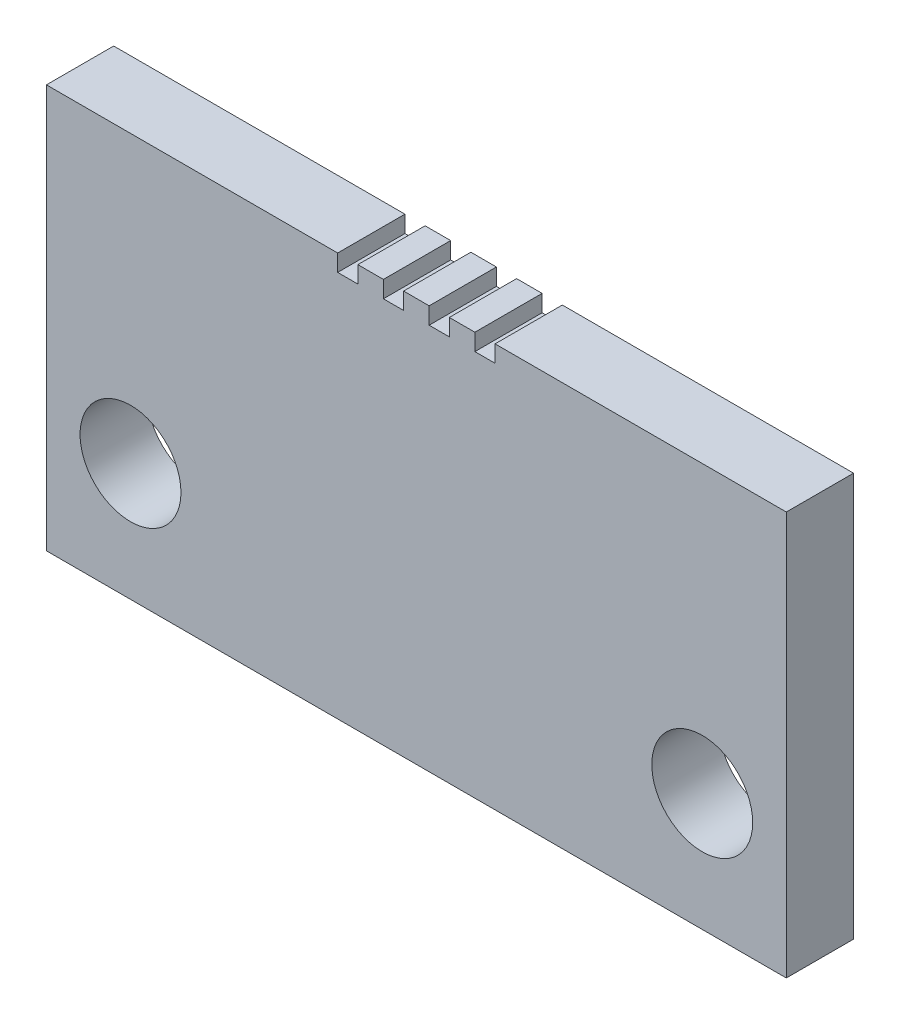
ISO-10303-21;
HEADER;
FILE_DESCRIPTION(('STEP AP214'),'2;1');
FILE_NAME('part.step','',(''),(''),'','','');
FILE_SCHEMA(('AUTOMOTIVE_DESIGN { 1 0 10303 214 1 1 1 1 }'));
ENDSEC;
DATA;
#1=APPLICATION_CONTEXT('core data for automotive mechanical design processes');
#2=APPLICATION_PROTOCOL_DEFINITION('international standard','automotive_design',2000,#1);
#3=PRODUCT_CONTEXT('',#1,'mechanical');
#4=PRODUCT('Part','Part','',(#3));
#5=PRODUCT_RELATED_PRODUCT_CATEGORY('part','',(#4));
#6=PRODUCT_DEFINITION_FORMATION('','',#4);
#7=PRODUCT_DEFINITION_CONTEXT('part definition',#1,'design');
#8=PRODUCT_DEFINITION('design','',#6,#7);
#9=PRODUCT_DEFINITION_SHAPE('','',#8);
#10=(LENGTH_UNIT() NAMED_UNIT(*) SI_UNIT(.MILLI.,.METRE.));
#11=(NAMED_UNIT(*) PLANE_ANGLE_UNIT() SI_UNIT($,.RADIAN.));
#12=(NAMED_UNIT(*) SI_UNIT($,.STERADIAN.) SOLID_ANGLE_UNIT());
#13=UNCERTAINTY_MEASURE_WITH_UNIT(LENGTH_MEASURE(1.E-05),#10,'distance_accuracy_value','');
#14=(GEOMETRIC_REPRESENTATION_CONTEXT(3) GLOBAL_UNCERTAINTY_ASSIGNED_CONTEXT((#13)) GLOBAL_UNIT_ASSIGNED_CONTEXT((#10,
#11,#12)) REPRESENTATION_CONTEXT('',''));
#15=CARTESIAN_POINT('',(0.,0.,0.));
#16=DIRECTION('',(0.,0.,1.));
#17=DIRECTION('',(1.,0.,0.));
#18=AXIS2_PLACEMENT_3D('',#15,#16,#17);
#19=CARTESIAN_POINT('',(0.,0.,2.));
#20=DIRECTION('',(0.,0.,1.));
#21=DIRECTION('',(1.,0.,0.));
#22=AXIS2_PLACEMENT_3D('',#19,#20,#21);
#23=PLANE('',#22);
#24=CARTESIAN_POINT('',(8.5,-2.50000000000001,2.));
#25=DIRECTION('',(0.,0.,1.));
#26=DIRECTION('',(1.,0.,0.));
#27=AXIS2_PLACEMENT_3D('',#24,#25,#26);
#28=CIRCLE('',#27,1.5);
#29=CARTESIAN_POINT('',(10.,-2.50000000000001,2.));
#30=VERTEX_POINT('',#29);
#31=EDGE_CURVE('E214',#30,#30,#28,.T.);
#32=ORIENTED_EDGE('',*,*,#31,.F.);
#33=EDGE_LOOP('',(#32));
#34=FACE_BOUND('',#33,.T.);
#35=DIRECTION('',(-1.,0.,0.));
#36=VECTOR('',#35,1.);
#37=CARTESIAN_POINT('',(2.34,5.99999999999999,2.));
#38=LINE('',#37,#36);
#39=CARTESIAN_POINT('',(11.,5.99999999999999,2.));
#40=VERTEX_POINT('',#39);
#41=CARTESIAN_POINT('',(2.34,5.99999999999999,2.));
#42=VERTEX_POINT('',#41);
#43=EDGE_CURVE('E249',#40,#42,#38,.T.);
#44=ORIENTED_EDGE('',*,*,#43,.T.);
#45=DIRECTION('',(0.,-1.,0.));
#46=VECTOR('',#45,1.);
#47=CARTESIAN_POINT('',(2.34,5.49999999999999,2.));
#48=LINE('',#47,#46);
#49=CARTESIAN_POINT('',(2.34,5.49999999999999,2.));
#50=VERTEX_POINT('',#49);
#51=EDGE_CURVE('E137',#42,#50,#48,.T.);
#52=ORIENTED_EDGE('',*,*,#51,.T.);
#53=DIRECTION('',(-1.,0.,0.));
#54=VECTOR('',#53,1.);
#55=CARTESIAN_POINT('',(1.74,5.49999999999999,2.));
#56=LINE('',#55,#54);
#57=CARTESIAN_POINT('',(1.74,5.49999999999999,2.));
#58=VERTEX_POINT('',#57);
#59=EDGE_CURVE('E300',#50,#58,#56,.T.);
#60=ORIENTED_EDGE('',*,*,#59,.T.);
#61=DIRECTION('',(0.,1.,0.));
#62=VECTOR('',#61,1.);
#63=CARTESIAN_POINT('',(1.74,5.99999999999999,2.));
#64=LINE('',#63,#62);
#65=CARTESIAN_POINT('',(1.74,5.99999999999999,2.));
#66=VERTEX_POINT('',#65);
#67=EDGE_CURVE('E319',#58,#66,#64,.T.);
#68=ORIENTED_EDGE('',*,*,#67,.T.);
#69=DIRECTION('',(-1.,0.,0.));
#70=VECTOR('',#69,1.);
#71=CARTESIAN_POINT('',(0.980000000000001,5.99999999999999,2.));
#72=LINE('',#71,#70);
#73=CARTESIAN_POINT('',(0.980000000000001,5.99999999999999,2.));
#74=VERTEX_POINT('',#73);
#75=EDGE_CURVE('E316',#66,#74,#72,.T.);
#76=ORIENTED_EDGE('',*,*,#75,.T.);
#77=DIRECTION('',(0.,-1.,0.));
#78=VECTOR('',#77,1.);
#79=CARTESIAN_POINT('',(0.98,5.49999999999999,2.));
#80=LINE('',#79,#78);
#81=CARTESIAN_POINT('',(0.98,5.49999999999999,2.));
#82=VERTEX_POINT('',#81);
#83=EDGE_CURVE('E318',#74,#82,#80,.T.);
#84=ORIENTED_EDGE('',*,*,#83,.T.);
#85=DIRECTION('',(-1.,0.,0.));
#86=VECTOR('',#85,1.);
#87=CARTESIAN_POINT('',(0.38,5.49999999999999,2.));
#88=LINE('',#87,#86);
#89=CARTESIAN_POINT('',(0.38,5.49999999999999,2.));
#90=VERTEX_POINT('',#89);
#91=EDGE_CURVE('E321',#82,#90,#88,.T.);
#92=ORIENTED_EDGE('',*,*,#91,.T.);
#93=DIRECTION('',(0.,1.,0.));
#94=VECTOR('',#93,1.);
#95=CARTESIAN_POINT('',(0.38,5.99999999999999,2.));
#96=LINE('',#95,#94);
#97=CARTESIAN_POINT('',(0.38,5.99999999999999,2.));
#98=VERTEX_POINT('',#97);
#99=EDGE_CURVE('E327',#90,#98,#96,.T.);
#100=ORIENTED_EDGE('',*,*,#99,.T.);
#101=DIRECTION('',(-1.,0.,0.));
#102=VECTOR('',#101,1.);
#103=CARTESIAN_POINT('',(-0.379999999999999,5.99999999999999,2.));
#104=LINE('',#103,#102);
#105=CARTESIAN_POINT('',(-0.379999999999999,5.99999999999999,2.));
#106=VERTEX_POINT('',#105);
#107=EDGE_CURVE('E329',#98,#106,#104,.T.);
#108=ORIENTED_EDGE('',*,*,#107,.T.);
#109=DIRECTION('',(0.,-1.,0.));
#110=VECTOR('',#109,1.);
#111=CARTESIAN_POINT('',(-0.379999999999999,5.49999999999999,2.));
#112=LINE('',#111,#110);
#113=CARTESIAN_POINT('',(-0.379999999999999,5.49999999999999,2.));
#114=VERTEX_POINT('',#113);
#115=EDGE_CURVE('E331',#106,#114,#112,.T.);
#116=ORIENTED_EDGE('',*,*,#115,.T.);
#117=DIRECTION('',(-1.,0.,0.));
#118=VECTOR('',#117,1.);
#119=CARTESIAN_POINT('',(-0.980000000000001,5.49999999999999,2.));
#120=LINE('',#119,#118);
#121=CARTESIAN_POINT('',(-0.980000000000001,5.49999999999999,2.));
#122=VERTEX_POINT('',#121);
#123=EDGE_CURVE('E333',#114,#122,#120,.T.);
#124=ORIENTED_EDGE('',*,*,#123,.T.);
#125=DIRECTION('',(0.,1.,0.));
#126=VECTOR('',#125,1.);
#127=CARTESIAN_POINT('',(-0.98,5.99999999999999,2.));
#128=LINE('',#127,#126);
#129=CARTESIAN_POINT('',(-0.98,5.99999999999999,2.));
#130=VERTEX_POINT('',#129);
#131=EDGE_CURVE('E335',#122,#130,#128,.T.);
#132=ORIENTED_EDGE('',*,*,#131,.T.);
#133=DIRECTION('',(-1.,0.,0.));
#134=VECTOR('',#133,1.);
#135=CARTESIAN_POINT('',(-1.74,5.99999999999999,2.));
#136=LINE('',#135,#134);
#137=CARTESIAN_POINT('',(-1.74,5.99999999999999,2.));
#138=VERTEX_POINT('',#137);
#139=EDGE_CURVE('E337',#130,#138,#136,.T.);
#140=ORIENTED_EDGE('',*,*,#139,.T.);
#141=DIRECTION('',(0.,-1.,0.));
#142=VECTOR('',#141,1.);
#143=CARTESIAN_POINT('',(-1.74,5.49999999999999,2.));
#144=LINE('',#143,#142);
#145=CARTESIAN_POINT('',(-1.74,5.49999999999999,2.));
#146=VERTEX_POINT('',#145);
#147=EDGE_CURVE('E339',#138,#146,#144,.T.);
#148=ORIENTED_EDGE('',*,*,#147,.T.);
#149=DIRECTION('',(-1.,0.,0.));
#150=VECTOR('',#149,1.);
#151=CARTESIAN_POINT('',(-2.34,5.49999999999999,2.));
#152=LINE('',#151,#150);
#153=CARTESIAN_POINT('',(-2.34,5.49999999999999,2.));
#154=VERTEX_POINT('',#153);
#155=EDGE_CURVE('E341',#146,#154,#152,.T.);
#156=ORIENTED_EDGE('',*,*,#155,.T.);
#157=DIRECTION('',(0.,1.,0.));
#158=VECTOR('',#157,1.);
#159=CARTESIAN_POINT('',(-2.34,5.99999999999999,2.));
#160=LINE('',#159,#158);
#161=CARTESIAN_POINT('',(-2.34,5.99999999999999,2.));
#162=VERTEX_POINT('',#161);
#163=EDGE_CURVE('E343',#154,#162,#160,.T.);
#164=ORIENTED_EDGE('',*,*,#163,.T.);
#165=DIRECTION('',(-1.,0.,0.));
#166=VECTOR('',#165,1.);
#167=CARTESIAN_POINT('',(-11.,5.99999999999999,2.));
#168=LINE('',#167,#166);
#169=CARTESIAN_POINT('',(-11.,5.99999999999999,2.));
#170=VERTEX_POINT('',#169);
#171=EDGE_CURVE('E192',#162,#170,#168,.T.);
#172=ORIENTED_EDGE('',*,*,#171,.T.);
#173=DIRECTION('',(0.,-1.,0.));
#174=VECTOR('',#173,1.);
#175=CARTESIAN_POINT('',(-11.,-6.00000000000001,2.));
#176=LINE('',#175,#174);
#177=CARTESIAN_POINT('',(-11.,-6.00000000000001,2.));
#178=VERTEX_POINT('',#177);
#179=EDGE_CURVE('E186',#170,#178,#176,.T.);
#180=ORIENTED_EDGE('',*,*,#179,.T.);
#181=DIRECTION('',(1.,0.,0.));
#182=VECTOR('',#181,1.);
#183=CARTESIAN_POINT('',(-11.,-6.00000000000001,2.));
#184=LINE('',#183,#182);
#185=CARTESIAN_POINT('',(11.,-6.00000000000001,2.));
#186=VERTEX_POINT('',#185);
#187=EDGE_CURVE('E190',#178,#186,#184,.T.);
#188=ORIENTED_EDGE('',*,*,#187,.T.);
#189=DIRECTION('',(0.,1.,0.));
#190=VECTOR('',#189,1.);
#191=CARTESIAN_POINT('',(11.,-6.00000000000001,2.));
#192=LINE('',#191,#190);
#193=EDGE_CURVE('E58',#186,#40,#192,.T.);
#194=ORIENTED_EDGE('',*,*,#193,.T.);
#195=EDGE_LOOP('',(#44,#52,#60,#68,#76,#84,#92,#100,#108,#116,#124,#132,#140,#148,#156,#164,
#172,#180,#188,#194));
#196=FACE_BOUND('',#195,.T.);
#197=CARTESIAN_POINT('',(-8.5,-2.50000000000001,2.));
#198=DIRECTION('',(0.,0.,1.));
#199=DIRECTION('',(1.,0.,0.));
#200=AXIS2_PLACEMENT_3D('',#197,#198,#199);
#201=CIRCLE('',#200,1.5);
#202=CARTESIAN_POINT('',(-7.,-2.50000000000001,2.));
#203=VERTEX_POINT('',#202);
#204=EDGE_CURVE('E385',#203,#203,#201,.T.);
#205=ORIENTED_EDGE('',*,*,#204,.F.);
#206=EDGE_LOOP('',(#205));
#207=FACE_BOUND('',#206,.T.);
#208=ADVANCED_FACE('F41',(#34,#196,#207),#23,.T.);
#209=CARTESIAN_POINT('',(0.,0.,0.));
#210=DIRECTION('',(0.,0.,1.));
#211=DIRECTION('',(1.,0.,0.));
#212=AXIS2_PLACEMENT_3D('',#209,#210,#211);
#213=PLANE('',#212);
#214=DIRECTION('',(-1.,0.,0.));
#215=VECTOR('',#214,1.);
#216=CARTESIAN_POINT('',(2.34,5.99999999999999,0.));
#217=LINE('',#216,#215);
#218=CARTESIAN_POINT('',(11.,5.99999999999999,0.));
#219=VERTEX_POINT('',#218);
#220=CARTESIAN_POINT('',(2.34,5.99999999999999,0.));
#221=VERTEX_POINT('',#220);
#222=EDGE_CURVE('E210',#219,#221,#217,.T.);
#223=ORIENTED_EDGE('',*,*,#222,.F.);
#224=DIRECTION('',(0.,1.,0.));
#225=VECTOR('',#224,1.);
#226=CARTESIAN_POINT('',(11.,-6.00000000000001,0.));
#227=LINE('',#226,#225);
#228=CARTESIAN_POINT('',(11.,-6.00000000000001,0.));
#229=VERTEX_POINT('',#228);
#230=EDGE_CURVE('E129',#229,#219,#227,.T.);
#231=ORIENTED_EDGE('',*,*,#230,.F.);
#232=DIRECTION('',(1.,0.,0.));
#233=VECTOR('',#232,1.);
#234=CARTESIAN_POINT('',(-11.,-6.00000000000001,0.));
#235=LINE('',#234,#233);
#236=CARTESIAN_POINT('',(-11.,-6.00000000000001,0.));
#237=VERTEX_POINT('',#236);
#238=EDGE_CURVE('E123',#237,#229,#235,.T.);
#239=ORIENTED_EDGE('',*,*,#238,.F.);
#240=DIRECTION('',(0.,-1.,0.));
#241=VECTOR('',#240,1.);
#242=CARTESIAN_POINT('',(-11.,-6.00000000000001,0.));
#243=LINE('',#242,#241);
#244=CARTESIAN_POINT('',(-11.,5.99999999999999,0.));
#245=VERTEX_POINT('',#244);
#246=EDGE_CURVE('E200',#245,#237,#243,.T.);
#247=ORIENTED_EDGE('',*,*,#246,.F.);
#248=DIRECTION('',(-1.,0.,0.));
#249=VECTOR('',#248,1.);
#250=CARTESIAN_POINT('',(-11.,5.99999999999999,0.));
#251=LINE('',#250,#249);
#252=CARTESIAN_POINT('',(-2.34,5.99999999999999,0.));
#253=VERTEX_POINT('',#252);
#254=EDGE_CURVE('E244',#253,#245,#251,.T.);
#255=ORIENTED_EDGE('',*,*,#254,.F.);
#256=DIRECTION('',(0.,1.,0.));
#257=VECTOR('',#256,1.);
#258=CARTESIAN_POINT('',(-2.34,5.99999999999999,0.));
#259=LINE('',#258,#257);
#260=CARTESIAN_POINT('',(-2.34,5.49999999999999,0.));
#261=VERTEX_POINT('',#260);
#262=EDGE_CURVE('E242',#261,#253,#259,.T.);
#263=ORIENTED_EDGE('',*,*,#262,.F.);
#264=DIRECTION('',(-1.,0.,0.));
#265=VECTOR('',#264,1.);
#266=CARTESIAN_POINT('',(-2.34,5.49999999999999,0.));
#267=LINE('',#266,#265);
#268=CARTESIAN_POINT('',(-1.74,5.49999999999999,0.));
#269=VERTEX_POINT('',#268);
#270=EDGE_CURVE('E240',#269,#261,#267,.T.);
#271=ORIENTED_EDGE('',*,*,#270,.F.);
#272=DIRECTION('',(0.,-1.,0.));
#273=VECTOR('',#272,1.);
#274=CARTESIAN_POINT('',(-1.74,5.49999999999999,0.));
#275=LINE('',#274,#273);
#276=CARTESIAN_POINT('',(-1.74,5.99999999999999,0.));
#277=VERTEX_POINT('',#276);
#278=EDGE_CURVE('E238',#277,#269,#275,.T.);
#279=ORIENTED_EDGE('',*,*,#278,.F.);
#280=DIRECTION('',(-1.,0.,0.));
#281=VECTOR('',#280,1.);
#282=CARTESIAN_POINT('',(-1.74,5.99999999999999,0.));
#283=LINE('',#282,#281);
#284=CARTESIAN_POINT('',(-0.98,5.99999999999999,0.));
#285=VERTEX_POINT('',#284);
#286=EDGE_CURVE('E236',#285,#277,#283,.T.);
#287=ORIENTED_EDGE('',*,*,#286,.F.);
#288=DIRECTION('',(0.,1.,0.));
#289=VECTOR('',#288,1.);
#290=CARTESIAN_POINT('',(-0.98,5.99999999999999,0.));
#291=LINE('',#290,#289);
#292=CARTESIAN_POINT('',(-0.980000000000001,5.49999999999999,0.));
#293=VERTEX_POINT('',#292);
#294=EDGE_CURVE('E234',#293,#285,#291,.T.);
#295=ORIENTED_EDGE('',*,*,#294,.F.);
#296=DIRECTION('',(-1.,0.,0.));
#297=VECTOR('',#296,1.);
#298=CARTESIAN_POINT('',(-0.980000000000001,5.49999999999999,0.));
#299=LINE('',#298,#297);
#300=CARTESIAN_POINT('',(-0.379999999999999,5.49999999999999,0.));
#301=VERTEX_POINT('',#300);
#302=EDGE_CURVE('E232',#301,#293,#299,.T.);
#303=ORIENTED_EDGE('',*,*,#302,.F.);
#304=DIRECTION('',(0.,-1.,0.));
#305=VECTOR('',#304,1.);
#306=CARTESIAN_POINT('',(-0.379999999999999,5.49999999999999,0.));
#307=LINE('',#306,#305);
#308=CARTESIAN_POINT('',(-0.379999999999999,5.99999999999999,0.));
#309=VERTEX_POINT('',#308);
#310=EDGE_CURVE('E230',#309,#301,#307,.T.);
#311=ORIENTED_EDGE('',*,*,#310,.F.);
#312=DIRECTION('',(-1.,0.,0.));
#313=VECTOR('',#312,1.);
#314=CARTESIAN_POINT('',(-0.379999999999999,5.99999999999999,0.));
#315=LINE('',#314,#313);
#316=CARTESIAN_POINT('',(0.38,5.99999999999999,0.));
#317=VERTEX_POINT('',#316);
#318=EDGE_CURVE('E228',#317,#309,#315,.T.);
#319=ORIENTED_EDGE('',*,*,#318,.F.);
#320=DIRECTION('',(0.,1.,0.));
#321=VECTOR('',#320,1.);
#322=CARTESIAN_POINT('',(0.38,5.99999999999999,0.));
#323=LINE('',#322,#321);
#324=CARTESIAN_POINT('',(0.38,5.49999999999999,0.));
#325=VERTEX_POINT('',#324);
#326=EDGE_CURVE('E226',#325,#317,#323,.T.);
#327=ORIENTED_EDGE('',*,*,#326,.F.);
#328=DIRECTION('',(-1.,0.,0.));
#329=VECTOR('',#328,1.);
#330=CARTESIAN_POINT('',(0.38,5.49999999999999,0.));
#331=LINE('',#330,#329);
#332=CARTESIAN_POINT('',(0.98,5.49999999999999,0.));
#333=VERTEX_POINT('',#332);
#334=EDGE_CURVE('E224',#333,#325,#331,.T.);
#335=ORIENTED_EDGE('',*,*,#334,.F.);
#336=DIRECTION('',(0.,-1.,0.));
#337=VECTOR('',#336,1.);
#338=CARTESIAN_POINT('',(0.98,5.49999999999999,0.));
#339=LINE('',#338,#337);
#340=CARTESIAN_POINT('',(0.980000000000001,5.99999999999999,0.));
#341=VERTEX_POINT('',#340);
#342=EDGE_CURVE('E222',#341,#333,#339,.T.);
#343=ORIENTED_EDGE('',*,*,#342,.F.);
#344=DIRECTION('',(-1.,0.,0.));
#345=VECTOR('',#344,1.);
#346=CARTESIAN_POINT('',(0.980000000000001,5.99999999999999,0.));
#347=LINE('',#346,#345);
#348=CARTESIAN_POINT('',(1.74,5.99999999999999,0.));
#349=VERTEX_POINT('',#348);
#350=EDGE_CURVE('E220',#349,#341,#347,.T.);
#351=ORIENTED_EDGE('',*,*,#350,.F.);
#352=DIRECTION('',(0.,1.,0.));
#353=VECTOR('',#352,1.);
#354=CARTESIAN_POINT('',(1.74,5.99999999999999,0.));
#355=LINE('',#354,#353);
#356=CARTESIAN_POINT('',(1.74,5.49999999999999,0.));
#357=VERTEX_POINT('',#356);
#358=EDGE_CURVE('E218',#357,#349,#355,.T.);
#359=ORIENTED_EDGE('',*,*,#358,.F.);
#360=DIRECTION('',(-1.,0.,0.));
#361=VECTOR('',#360,1.);
#362=CARTESIAN_POINT('',(1.74,5.49999999999999,0.));
#363=LINE('',#362,#361);
#364=CARTESIAN_POINT('',(2.34,5.49999999999999,0.));
#365=VERTEX_POINT('',#364);
#366=EDGE_CURVE('E216',#365,#357,#363,.T.);
#367=ORIENTED_EDGE('',*,*,#366,.F.);
#368=DIRECTION('',(0.,-1.,0.));
#369=VECTOR('',#368,1.);
#370=CARTESIAN_POINT('',(2.34,5.49999999999999,0.));
#371=LINE('',#370,#369);
#372=EDGE_CURVE('E213',#221,#365,#371,.T.);
#373=ORIENTED_EDGE('',*,*,#372,.F.);
#374=EDGE_LOOP('',(#223,#231,#239,#247,#255,#263,#271,#279,#287,#295,#303,#311,#319,#327,#335,
#343,#351,#359,#367,#373));
#375=FACE_BOUND('',#374,.T.);
#376=CARTESIAN_POINT('',(8.5,-2.50000000000001,0.));
#377=DIRECTION('',(0.,0.,1.));
#378=DIRECTION('',(1.,0.,0.));
#379=AXIS2_PLACEMENT_3D('',#376,#377,#378);
#380=CIRCLE('',#379,1.5);
#381=CARTESIAN_POINT('',(10.,-2.50000000000001,0.));
#382=VERTEX_POINT('',#381);
#383=EDGE_CURVE('E391',#382,#382,#380,.T.);
#384=ORIENTED_EDGE('',*,*,#383,.T.);
#385=EDGE_LOOP('',(#384));
#386=FACE_BOUND('',#385,.T.);
#387=CARTESIAN_POINT('',(-8.5,-2.50000000000001,0.));
#388=DIRECTION('',(0.,0.,1.));
#389=DIRECTION('',(1.,0.,0.));
#390=AXIS2_PLACEMENT_3D('',#387,#388,#389);
#391=CIRCLE('',#390,1.5);
#392=CARTESIAN_POINT('',(-7.,-2.50000000000001,0.));
#393=VERTEX_POINT('',#392);
#394=EDGE_CURVE('E388',#393,#393,#391,.T.);
#395=ORIENTED_EDGE('',*,*,#394,.T.);
#396=EDGE_LOOP('',(#395));
#397=FACE_BOUND('',#396,.T.);
#398=ADVANCED_FACE('F304',(#375,#386,#397),#213,.F.);
#399=CARTESIAN_POINT('',(2.34,5.99999999999999,2.));
#400=DIRECTION('',(0.,-1.,0.));
#401=DIRECTION('',(0.,0.,-1.));
#402=AXIS2_PLACEMENT_3D('',#399,#400,#401);
#403=PLANE('',#402);
#404=ORIENTED_EDGE('',*,*,#222,.T.);
#405=DIRECTION('',(0.,0.,-1.));
#406=VECTOR('',#405,1.);
#407=CARTESIAN_POINT('',(2.34,5.99999999999999,2.));
#408=LINE('',#407,#406);
#409=EDGE_CURVE('E11',#42,#221,#408,.T.);
#410=ORIENTED_EDGE('',*,*,#409,.F.);
#411=ORIENTED_EDGE('',*,*,#43,.F.);
#412=DIRECTION('',(0.,0.,-1.));
#413=VECTOR('',#412,1.);
#414=CARTESIAN_POINT('',(11.,5.99999999999999,2.));
#415=LINE('',#414,#413);
#416=EDGE_CURVE('E206',#40,#219,#415,.T.);
#417=ORIENTED_EDGE('',*,*,#416,.T.);
#418=EDGE_LOOP('',(#404,#410,#411,#417));
#419=FACE_BOUND('',#418,.T.);
#420=ADVANCED_FACE('F43',(#419),#403,.F.);
#421=CARTESIAN_POINT('',(2.34,5.49999999999999,2.));
#422=DIRECTION('',(1.,0.,0.));
#423=DIRECTION('',(0.,0.,-1.));
#424=AXIS2_PLACEMENT_3D('',#421,#422,#423);
#425=PLANE('',#424);
#426=ORIENTED_EDGE('',*,*,#372,.T.);
#427=DIRECTION('',(0.,0.,-1.));
#428=VECTOR('',#427,1.);
#429=CARTESIAN_POINT('',(2.34,5.49999999999999,2.));
#430=LINE('',#429,#428);
#431=EDGE_CURVE('E50',#50,#365,#430,.T.);
#432=ORIENTED_EDGE('',*,*,#431,.F.);
#433=ORIENTED_EDGE('',*,*,#51,.F.);
#434=ORIENTED_EDGE('',*,*,#409,.T.);
#435=EDGE_LOOP('',(#426,#432,#433,#434));
#436=FACE_BOUND('',#435,.T.);
#437=ADVANCED_FACE('F582',(#436),#425,.F.);
#438=CARTESIAN_POINT('',(1.74,5.49999999999999,2.));
#439=DIRECTION('',(0.,-1.,0.));
#440=DIRECTION('',(1.,0.,0.));
#441=AXIS2_PLACEMENT_3D('',#438,#439,#440);
#442=PLANE('',#441);
#443=ORIENTED_EDGE('',*,*,#366,.T.);
#444=DIRECTION('',(0.,0.,-1.));
#445=VECTOR('',#444,1.);
#446=CARTESIAN_POINT('',(1.74,5.49999999999999,2.));
#447=LINE('',#446,#445);
#448=EDGE_CURVE('E292',#58,#357,#447,.T.);
#449=ORIENTED_EDGE('',*,*,#448,.F.);
#450=ORIENTED_EDGE('',*,*,#59,.F.);
#451=ORIENTED_EDGE('',*,*,#431,.T.);
#452=EDGE_LOOP('',(#443,#449,#450,#451));
#453=FACE_BOUND('',#452,.T.);
#454=ADVANCED_FACE('F298',(#453),#442,.F.);
#455=CARTESIAN_POINT('',(1.74,5.99999999999999,2.));
#456=DIRECTION('',(-1.,0.,0.));
#457=DIRECTION('',(0.,-1.,0.));
#458=AXIS2_PLACEMENT_3D('',#455,#456,#457);
#459=PLANE('',#458);
#460=ORIENTED_EDGE('',*,*,#358,.T.);
#461=DIRECTION('',(0.,0.,-1.));
#462=VECTOR('',#461,1.);
#463=CARTESIAN_POINT('',(1.74,5.99999999999999,2.));
#464=LINE('',#463,#462);
#465=EDGE_CURVE('E289',#66,#349,#464,.T.);
#466=ORIENTED_EDGE('',*,*,#465,.F.);
#467=ORIENTED_EDGE('',*,*,#67,.F.);
#468=ORIENTED_EDGE('',*,*,#448,.T.);
#469=EDGE_LOOP('',(#460,#466,#467,#468));
#470=FACE_BOUND('',#469,.T.);
#471=ADVANCED_FACE('F310',(#470),#459,.F.);
#472=CARTESIAN_POINT('',(0.980000000000001,5.99999999999999,2.));
#473=DIRECTION('',(0.,-1.,0.));
#474=DIRECTION('',(0.,0.,-1.));
#475=AXIS2_PLACEMENT_3D('',#472,#473,#474);
#476=PLANE('',#475);
#477=ORIENTED_EDGE('',*,*,#350,.T.);
#478=DIRECTION('',(0.,0.,-1.));
#479=VECTOR('',#478,1.);
#480=CARTESIAN_POINT('',(0.980000000000001,5.99999999999999,2.));
#481=LINE('',#480,#479);
#482=EDGE_CURVE('E286',#74,#341,#481,.T.);
#483=ORIENTED_EDGE('',*,*,#482,.F.);
#484=ORIENTED_EDGE('',*,*,#75,.F.);
#485=ORIENTED_EDGE('',*,*,#465,.T.);
#486=EDGE_LOOP('',(#477,#483,#484,#485));
#487=FACE_BOUND('',#486,.T.);
#488=ADVANCED_FACE('F314',(#487),#476,.F.);
#489=CARTESIAN_POINT('',(0.98,5.49999999999999,2.));
#490=DIRECTION('',(1.,0.,0.));
#491=DIRECTION('',(0.,1.,0.));
#492=AXIS2_PLACEMENT_3D('',#489,#490,#491);
#493=PLANE('',#492);
#494=ORIENTED_EDGE('',*,*,#342,.T.);
#495=DIRECTION('',(0.,0.,-1.));
#496=VECTOR('',#495,1.);
#497=CARTESIAN_POINT('',(0.98,5.49999999999999,2.));
#498=LINE('',#497,#496);
#499=EDGE_CURVE('E283',#82,#333,#498,.T.);
#500=ORIENTED_EDGE('',*,*,#499,.F.);
#501=ORIENTED_EDGE('',*,*,#83,.F.);
#502=ORIENTED_EDGE('',*,*,#482,.T.);
#503=EDGE_LOOP('',(#494,#500,#501,#502));
#504=FACE_BOUND('',#503,.T.);
#505=ADVANCED_FACE('F543',(#504),#493,.F.);
#506=CARTESIAN_POINT('',(0.38,5.49999999999999,2.));
#507=DIRECTION('',(0.,-1.,0.));
#508=DIRECTION('',(1.,0.,0.));
#509=AXIS2_PLACEMENT_3D('',#506,#507,#508);
#510=PLANE('',#509);
#511=ORIENTED_EDGE('',*,*,#334,.T.);
#512=DIRECTION('',(0.,0.,-1.));
#513=VECTOR('',#512,1.);
#514=CARTESIAN_POINT('',(0.38,5.49999999999999,2.));
#515=LINE('',#514,#513);
#516=EDGE_CURVE('E280',#90,#325,#515,.T.);
#517=ORIENTED_EDGE('',*,*,#516,.F.);
#518=ORIENTED_EDGE('',*,*,#91,.F.);
#519=ORIENTED_EDGE('',*,*,#499,.T.);
#520=EDGE_LOOP('',(#511,#517,#518,#519));
#521=FACE_BOUND('',#520,.T.);
#522=ADVANCED_FACE('F532',(#521),#510,.F.);
#523=CARTESIAN_POINT('',(0.38,5.99999999999999,2.));
#524=DIRECTION('',(-1.,0.,0.));
#525=DIRECTION('',(0.,-1.,0.));
#526=AXIS2_PLACEMENT_3D('',#523,#524,#525);
#527=PLANE('',#526);
#528=ORIENTED_EDGE('',*,*,#326,.T.);
#529=DIRECTION('',(0.,0.,-1.));
#530=VECTOR('',#529,1.);
#531=CARTESIAN_POINT('',(0.38,5.99999999999999,2.));
#532=LINE('',#531,#530);
#533=EDGE_CURVE('E277',#98,#317,#532,.T.);
#534=ORIENTED_EDGE('',*,*,#533,.F.);
#535=ORIENTED_EDGE('',*,*,#99,.F.);
#536=ORIENTED_EDGE('',*,*,#516,.T.);
#537=EDGE_LOOP('',(#528,#534,#535,#536));
#538=FACE_BOUND('',#537,.T.);
#539=ADVANCED_FACE('F521',(#538),#527,.F.);
#540=CARTESIAN_POINT('',(-0.379999999999999,5.99999999999999,2.));
#541=DIRECTION('',(0.,-1.,0.));
#542=DIRECTION('',(0.,0.,-1.));
#543=AXIS2_PLACEMENT_3D('',#540,#541,#542);
#544=PLANE('',#543);
#545=ORIENTED_EDGE('',*,*,#318,.T.);
#546=DIRECTION('',(0.,0.,-1.));
#547=VECTOR('',#546,1.);
#548=CARTESIAN_POINT('',(-0.379999999999999,5.99999999999999,2.));
#549=LINE('',#548,#547);
#550=EDGE_CURVE('E274',#106,#309,#549,.T.);
#551=ORIENTED_EDGE('',*,*,#550,.F.);
#552=ORIENTED_EDGE('',*,*,#107,.F.);
#553=ORIENTED_EDGE('',*,*,#533,.T.);
#554=EDGE_LOOP('',(#545,#551,#552,#553));
#555=FACE_BOUND('',#554,.T.);
#556=ADVANCED_FACE('F510',(#555),#544,.F.);
#557=CARTESIAN_POINT('',(-0.379999999999999,5.49999999999999,2.));
#558=DIRECTION('',(1.,0.,0.));
#559=DIRECTION('',(0.,1.,0.));
#560=AXIS2_PLACEMENT_3D('',#557,#558,#559);
#561=PLANE('',#560);
#562=ORIENTED_EDGE('',*,*,#310,.T.);
#563=DIRECTION('',(0.,0.,-1.));
#564=VECTOR('',#563,1.);
#565=CARTESIAN_POINT('',(-0.379999999999999,5.49999999999999,2.));
#566=LINE('',#565,#564);
#567=EDGE_CURVE('E271',#114,#301,#566,.T.);
#568=ORIENTED_EDGE('',*,*,#567,.F.);
#569=ORIENTED_EDGE('',*,*,#115,.F.);
#570=ORIENTED_EDGE('',*,*,#550,.T.);
#571=EDGE_LOOP('',(#562,#568,#569,#570));
#572=FACE_BOUND('',#571,.T.);
#573=ADVANCED_FACE('F499',(#572),#561,.F.);
#574=CARTESIAN_POINT('',(-0.980000000000001,5.49999999999999,2.));
#575=DIRECTION('',(0.,-1.,0.));
#576=DIRECTION('',(0.,0.,-1.));
#577=AXIS2_PLACEMENT_3D('',#574,#575,#576);
#578=PLANE('',#577);
#579=ORIENTED_EDGE('',*,*,#302,.T.);
#580=DIRECTION('',(0.,0.,-1.));
#581=VECTOR('',#580,1.);
#582=CARTESIAN_POINT('',(-0.980000000000001,5.49999999999999,2.));
#583=LINE('',#582,#581);
#584=EDGE_CURVE('E268',#122,#293,#583,.T.);
#585=ORIENTED_EDGE('',*,*,#584,.F.);
#586=ORIENTED_EDGE('',*,*,#123,.F.);
#587=ORIENTED_EDGE('',*,*,#567,.T.);
#588=EDGE_LOOP('',(#579,#585,#586,#587));
#589=FACE_BOUND('',#588,.T.);
#590=ADVANCED_FACE('F488',(#589),#578,.F.);
#591=CARTESIAN_POINT('',(-0.98,5.99999999999999,2.));
#592=DIRECTION('',(-1.,0.,0.));
#593=DIRECTION('',(0.,-1.,0.));
#594=AXIS2_PLACEMENT_3D('',#591,#592,#593);
#595=PLANE('',#594);
#596=ORIENTED_EDGE('',*,*,#294,.T.);
#597=DIRECTION('',(0.,0.,-1.));
#598=VECTOR('',#597,1.);
#599=CARTESIAN_POINT('',(-0.98,5.99999999999999,2.));
#600=LINE('',#599,#598);
#601=EDGE_CURVE('E265',#130,#285,#600,.T.);
#602=ORIENTED_EDGE('',*,*,#601,.F.);
#603=ORIENTED_EDGE('',*,*,#131,.F.);
#604=ORIENTED_EDGE('',*,*,#584,.T.);
#605=EDGE_LOOP('',(#596,#602,#603,#604));
#606=FACE_BOUND('',#605,.T.);
#607=ADVANCED_FACE('F477',(#606),#595,.F.);
#608=CARTESIAN_POINT('',(-1.74,5.99999999999999,2.));
#609=DIRECTION('',(0.,-1.,0.));
#610=DIRECTION('',(0.,0.,-1.));
#611=AXIS2_PLACEMENT_3D('',#608,#609,#610);
#612=PLANE('',#611);
#613=ORIENTED_EDGE('',*,*,#286,.T.);
#614=DIRECTION('',(0.,0.,-1.));
#615=VECTOR('',#614,1.);
#616=CARTESIAN_POINT('',(-1.74,5.99999999999999,2.));
#617=LINE('',#616,#615);
#618=EDGE_CURVE('E262',#138,#277,#617,.T.);
#619=ORIENTED_EDGE('',*,*,#618,.F.);
#620=ORIENTED_EDGE('',*,*,#139,.F.);
#621=ORIENTED_EDGE('',*,*,#601,.T.);
#622=EDGE_LOOP('',(#613,#619,#620,#621));
#623=FACE_BOUND('',#622,.T.);
#624=ADVANCED_FACE('F466',(#623),#612,.F.);
#625=CARTESIAN_POINT('',(-1.74,5.49999999999999,2.));
#626=DIRECTION('',(1.,0.,0.));
#627=DIRECTION('',(0.,1.,0.));
#628=AXIS2_PLACEMENT_3D('',#625,#626,#627);
#629=PLANE('',#628);
#630=ORIENTED_EDGE('',*,*,#278,.T.);
#631=DIRECTION('',(0.,0.,-1.));
#632=VECTOR('',#631,1.);
#633=CARTESIAN_POINT('',(-1.74,5.49999999999999,2.));
#634=LINE('',#633,#632);
#635=EDGE_CURVE('E259',#146,#269,#634,.T.);
#636=ORIENTED_EDGE('',*,*,#635,.F.);
#637=ORIENTED_EDGE('',*,*,#147,.F.);
#638=ORIENTED_EDGE('',*,*,#618,.T.);
#639=EDGE_LOOP('',(#630,#636,#637,#638));
#640=FACE_BOUND('',#639,.T.);
#641=ADVANCED_FACE('F455',(#640),#629,.F.);
#642=CARTESIAN_POINT('',(-2.34,5.49999999999999,2.));
#643=DIRECTION('',(0.,-1.,0.));
#644=DIRECTION('',(1.,0.,0.));
#645=AXIS2_PLACEMENT_3D('',#642,#643,#644);
#646=PLANE('',#645);
#647=ORIENTED_EDGE('',*,*,#270,.T.);
#648=DIRECTION('',(0.,0.,-1.));
#649=VECTOR('',#648,1.);
#650=CARTESIAN_POINT('',(-2.34,5.49999999999999,2.));
#651=LINE('',#650,#649);
#652=EDGE_CURVE('E256',#154,#261,#651,.T.);
#653=ORIENTED_EDGE('',*,*,#652,.F.);
#654=ORIENTED_EDGE('',*,*,#155,.F.);
#655=ORIENTED_EDGE('',*,*,#635,.T.);
#656=EDGE_LOOP('',(#647,#653,#654,#655));
#657=FACE_BOUND('',#656,.T.);
#658=ADVANCED_FACE('F445',(#657),#646,.F.);
#659=CARTESIAN_POINT('',(-2.34,5.99999999999999,2.));
#660=DIRECTION('',(-1.,0.,0.));
#661=DIRECTION('',(0.,-1.,0.));
#662=AXIS2_PLACEMENT_3D('',#659,#660,#661);
#663=PLANE('',#662);
#664=ORIENTED_EDGE('',*,*,#262,.T.);
#665=DIRECTION('',(0.,0.,-1.));
#666=VECTOR('',#665,1.);
#667=CARTESIAN_POINT('',(-2.34,5.99999999999999,2.));
#668=LINE('',#667,#666);
#669=EDGE_CURVE('E253',#162,#253,#668,.T.);
#670=ORIENTED_EDGE('',*,*,#669,.F.);
#671=ORIENTED_EDGE('',*,*,#163,.F.);
#672=ORIENTED_EDGE('',*,*,#652,.T.);
#673=EDGE_LOOP('',(#664,#670,#671,#672));
#674=FACE_BOUND('',#673,.T.);
#675=ADVANCED_FACE('F349',(#674),#663,.F.);
#676=CARTESIAN_POINT('',(-11.,5.99999999999999,2.));
#677=DIRECTION('',(0.,-1.,0.));
#678=DIRECTION('',(0.,0.,-1.));
#679=AXIS2_PLACEMENT_3D('',#676,#677,#678);
#680=PLANE('',#679);
#681=ORIENTED_EDGE('',*,*,#254,.T.);
#682=DIRECTION('',(0.,0.,-1.));
#683=VECTOR('',#682,1.);
#684=CARTESIAN_POINT('',(-11.,5.99999999999999,2.));
#685=LINE('',#684,#683);
#686=EDGE_CURVE('E201',#170,#245,#685,.T.);
#687=ORIENTED_EDGE('',*,*,#686,.F.);
#688=ORIENTED_EDGE('',*,*,#171,.F.);
#689=ORIENTED_EDGE('',*,*,#669,.T.);
#690=EDGE_LOOP('',(#681,#687,#688,#689));
#691=FACE_BOUND('',#690,.T.);
#692=ADVANCED_FACE('F353',(#691),#680,.F.);
#693=CARTESIAN_POINT('',(-11.,-6.00000000000001,2.));
#694=DIRECTION('',(1.,0.,0.));
#695=DIRECTION('',(0.,0.,-1.));
#696=AXIS2_PLACEMENT_3D('',#693,#694,#695);
#697=PLANE('',#696);
#698=ORIENTED_EDGE('',*,*,#246,.T.);
#699=DIRECTION('',(0.,0.,-1.));
#700=VECTOR('',#699,1.);
#701=CARTESIAN_POINT('',(-11.,-6.00000000000001,2.));
#702=LINE('',#701,#700);
#703=EDGE_CURVE('E197',#178,#237,#702,.T.);
#704=ORIENTED_EDGE('',*,*,#703,.F.);
#705=ORIENTED_EDGE('',*,*,#179,.F.);
#706=ORIENTED_EDGE('',*,*,#686,.T.);
#707=EDGE_LOOP('',(#698,#704,#705,#706));
#708=FACE_BOUND('',#707,.T.);
#709=ADVANCED_FACE('F198',(#708),#697,.F.);
#710=CARTESIAN_POINT('',(-11.,-6.00000000000001,2.));
#711=DIRECTION('',(0.,1.,0.));
#712=DIRECTION('',(0.,0.,1.));
#713=AXIS2_PLACEMENT_3D('',#710,#711,#712);
#714=PLANE('',#713);
#715=ORIENTED_EDGE('',*,*,#238,.T.);
#716=DIRECTION('',(0.,0.,-1.));
#717=VECTOR('',#716,1.);
#718=CARTESIAN_POINT('',(11.,-6.00000000000001,2.));
#719=LINE('',#718,#717);
#720=EDGE_CURVE('E202',#186,#229,#719,.T.);
#721=ORIENTED_EDGE('',*,*,#720,.F.);
#722=ORIENTED_EDGE('',*,*,#187,.F.);
#723=ORIENTED_EDGE('',*,*,#703,.T.);
#724=EDGE_LOOP('',(#715,#721,#722,#723));
#725=FACE_BOUND('',#724,.T.);
#726=ADVANCED_FACE('F204',(#725),#714,.F.);
#727=CARTESIAN_POINT('',(11.,-6.00000000000001,2.));
#728=DIRECTION('',(-1.,0.,0.));
#729=DIRECTION('',(0.,0.,1.));
#730=AXIS2_PLACEMENT_3D('',#727,#728,#729);
#731=PLANE('',#730);
#732=ORIENTED_EDGE('',*,*,#230,.T.);
#733=ORIENTED_EDGE('',*,*,#416,.F.);
#734=ORIENTED_EDGE('',*,*,#193,.F.);
#735=ORIENTED_EDGE('',*,*,#720,.T.);
#736=EDGE_LOOP('',(#732,#733,#734,#735));
#737=FACE_BOUND('',#736,.T.);
#738=ADVANCED_FACE('F357',(#737),#731,.F.);
#739=CARTESIAN_POINT('',(8.5,-2.50000000000001,2.));
#740=DIRECTION('',(0.,0.,-1.));
#741=DIRECTION('',(-1.,0.,0.));
#742=AXIS2_PLACEMENT_3D('',#739,#740,#741);
#743=CYLINDRICAL_SURFACE('',#742,1.5);
#744=ORIENTED_EDGE('',*,*,#31,.T.);
#745=EDGE_LOOP('',(#744));
#746=FACE_BOUND('',#745,.T.);
#747=ORIENTED_EDGE('',*,*,#383,.F.);
#748=EDGE_LOOP('',(#747));
#749=FACE_BOUND('',#748,.T.);
#750=ADVANCED_FACE('F359',(#746,#749),#743,.F.);
#751=CARTESIAN_POINT('',(-8.5,-2.50000000000001,2.));
#752=DIRECTION('',(0.,0.,-1.));
#753=DIRECTION('',(-1.,0.,0.));
#754=AXIS2_PLACEMENT_3D('',#751,#752,#753);
#755=CYLINDRICAL_SURFACE('',#754,1.5);
#756=ORIENTED_EDGE('',*,*,#204,.T.);
#757=EDGE_LOOP('',(#756));
#758=FACE_BOUND('',#757,.T.);
#759=ORIENTED_EDGE('',*,*,#394,.F.);
#760=EDGE_LOOP('',(#759));
#761=FACE_BOUND('',#760,.T.);
#762=ADVANCED_FACE('F365',(#758,#761),#755,.F.);
#763=CLOSED_SHELL('',(#208,#398,#420,#437,#454,#471,#488,#505,#522,#539,#556,#573,#590,#607,
#624,#641,#658,#675,#692,#709,#726,#738,#750,#762));
#764=MANIFOLD_SOLID_BREP('B2',#763);
#765=ADVANCED_BREP_SHAPE_REPRESENTATION('',(#18,#764),#14);
#766=SHAPE_DEFINITION_REPRESENTATION(#9,#765);
ENDSEC;
END-ISO-10303-21;
